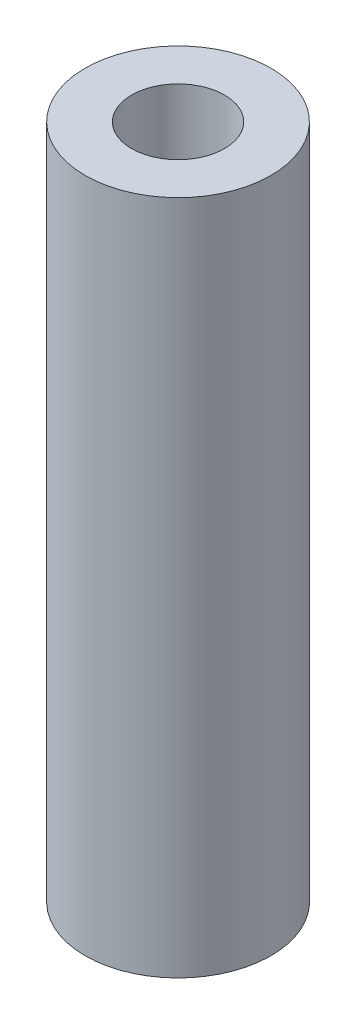
ISO-10303-21;
HEADER;
FILE_DESCRIPTION(('STEP AP214'),'2;1');
FILE_NAME('part.step','',(''),(''),'','','');
FILE_SCHEMA(('AUTOMOTIVE_DESIGN { 1 0 10303 214 1 1 1 1 }'));
ENDSEC;
DATA;
#1=APPLICATION_CONTEXT('core data for automotive mechanical design processes');
#2=APPLICATION_PROTOCOL_DEFINITION('international standard','automotive_design',2000,#1);
#3=PRODUCT_CONTEXT('',#1,'mechanical');
#4=PRODUCT('Part','Part','',(#3));
#5=PRODUCT_RELATED_PRODUCT_CATEGORY('part','',(#4));
#6=PRODUCT_DEFINITION_FORMATION('','',#4);
#7=PRODUCT_DEFINITION_CONTEXT('part definition',#1,'design');
#8=PRODUCT_DEFINITION('design','',#6,#7);
#9=PRODUCT_DEFINITION_SHAPE('','',#8);
#10=(LENGTH_UNIT() NAMED_UNIT(*) SI_UNIT(.MILLI.,.METRE.));
#11=(NAMED_UNIT(*) PLANE_ANGLE_UNIT() SI_UNIT($,.RADIAN.));
#12=(NAMED_UNIT(*) SI_UNIT($,.STERADIAN.) SOLID_ANGLE_UNIT());
#13=UNCERTAINTY_MEASURE_WITH_UNIT(LENGTH_MEASURE(1.E-05),#10,'distance_accuracy_value','');
#14=(GEOMETRIC_REPRESENTATION_CONTEXT(3) GLOBAL_UNCERTAINTY_ASSIGNED_CONTEXT((#13)) GLOBAL_UNIT_ASSIGNED_CONTEXT((#10,
#11,#12)) REPRESENTATION_CONTEXT('',''));
#15=CARTESIAN_POINT('',(0.,0.,0.));
#16=DIRECTION('',(0.,0.,1.));
#17=DIRECTION('',(1.,0.,0.));
#18=AXIS2_PLACEMENT_3D('',#15,#16,#17);
#19=CARTESIAN_POINT('',(0.,40.,0.));
#20=DIRECTION('',(0.,1.,0.));
#21=DIRECTION('',(0.,0.,1.));
#22=AXIS2_PLACEMENT_3D('',#19,#20,#21);
#23=PLANE('',#22);
#24=CARTESIAN_POINT('',(0.,40.,0.));
#25=DIRECTION('',(0.,1.,0.));
#26=DIRECTION('',(0.,0.,1.));
#27=AXIS2_PLACEMENT_3D('',#24,#25,#26);
#28=CIRCLE('',#27,11.);
#29=CARTESIAN_POINT('',(0.,40.,11.));
#30=VERTEX_POINT('',#29);
#31=EDGE_CURVE('E10',#30,#30,#28,.T.);
#32=ORIENTED_EDGE('',*,*,#31,.T.);
#33=EDGE_LOOP('',(#32));
#34=FACE_BOUND('',#33,.T.);
#35=CARTESIAN_POINT('',(0.,40.,0.));
#36=DIRECTION('',(0.,1.,0.));
#37=DIRECTION('',(0.,0.,1.));
#38=AXIS2_PLACEMENT_3D('',#35,#36,#37);
#39=CIRCLE('',#38,5.5);
#40=CARTESIAN_POINT('',(0.,40.,5.5));
#41=VERTEX_POINT('',#40);
#42=EDGE_CURVE('E54',#41,#41,#39,.T.);
#43=ORIENTED_EDGE('',*,*,#42,.F.);
#44=EDGE_LOOP('',(#43));
#45=FACE_BOUND('',#44,.T.);
#46=ADVANCED_FACE('F43',(#34,#45),#23,.T.);
#47=CARTESIAN_POINT('',(0.,-40.,0.));
#48=DIRECTION('',(0.,1.,0.));
#49=DIRECTION('',(0.,0.,1.));
#50=AXIS2_PLACEMENT_3D('',#47,#48,#49);
#51=PLANE('',#50);
#52=CARTESIAN_POINT('',(0.,-40.,0.));
#53=DIRECTION('',(0.,1.,0.));
#54=DIRECTION('',(0.,0.,1.));
#55=AXIS2_PLACEMENT_3D('',#52,#53,#54);
#56=CIRCLE('',#55,11.);
#57=CARTESIAN_POINT('',(0.,-40.,11.));
#58=VERTEX_POINT('',#57);
#59=EDGE_CURVE('E47',#58,#58,#56,.T.);
#60=ORIENTED_EDGE('',*,*,#59,.F.);
#61=EDGE_LOOP('',(#60));
#62=FACE_BOUND('',#61,.T.);
#63=CARTESIAN_POINT('',(0.,-40.,0.));
#64=DIRECTION('',(0.,1.,0.));
#65=DIRECTION('',(0.,0.,1.));
#66=AXIS2_PLACEMENT_3D('',#63,#64,#65);
#67=CIRCLE('',#66,5.5);
#68=CARTESIAN_POINT('',(0.,-40.,5.5));
#69=VERTEX_POINT('',#68);
#70=EDGE_CURVE('E56',#69,#69,#67,.T.);
#71=ORIENTED_EDGE('',*,*,#70,.T.);
#72=EDGE_LOOP('',(#71));
#73=FACE_BOUND('',#72,.T.);
#74=ADVANCED_FACE('F66',(#62,#73),#51,.F.);
#75=CARTESIAN_POINT('',(0.,40.,0.));
#76=DIRECTION('',(0.,-1.,0.));
#77=DIRECTION('',(0.,0.,-1.));
#78=AXIS2_PLACEMENT_3D('',#75,#76,#77);
#79=CYLINDRICAL_SURFACE('',#78,11.);
#80=ORIENTED_EDGE('',*,*,#31,.F.);
#81=EDGE_LOOP('',(#80));
#82=FACE_BOUND('',#81,.T.);
#83=ORIENTED_EDGE('',*,*,#59,.T.);
#84=EDGE_LOOP('',(#83));
#85=FACE_BOUND('',#84,.T.);
#86=ADVANCED_FACE('F45',(#82,#85),#79,.T.);
#87=CARTESIAN_POINT('',(0.,40.,0.));
#88=DIRECTION('',(0.,-1.,0.));
#89=DIRECTION('',(0.,0.,-1.));
#90=AXIS2_PLACEMENT_3D('',#87,#88,#89);
#91=CYLINDRICAL_SURFACE('',#90,5.5);
#92=ORIENTED_EDGE('',*,*,#42,.T.);
#93=EDGE_LOOP('',(#92));
#94=FACE_BOUND('',#93,.T.);
#95=ORIENTED_EDGE('',*,*,#70,.F.);
#96=EDGE_LOOP('',(#95));
#97=FACE_BOUND('',#96,.T.);
#98=ADVANCED_FACE('F62',(#94,#97),#91,.F.);
#99=CLOSED_SHELL('',(#46,#74,#86,#98));
#100=MANIFOLD_SOLID_BREP('B2',#99);
#101=ADVANCED_BREP_SHAPE_REPRESENTATION('',(#18,#100),#14);
#102=SHAPE_DEFINITION_REPRESENTATION(#9,#101);
ENDSEC;
END-ISO-10303-21;
